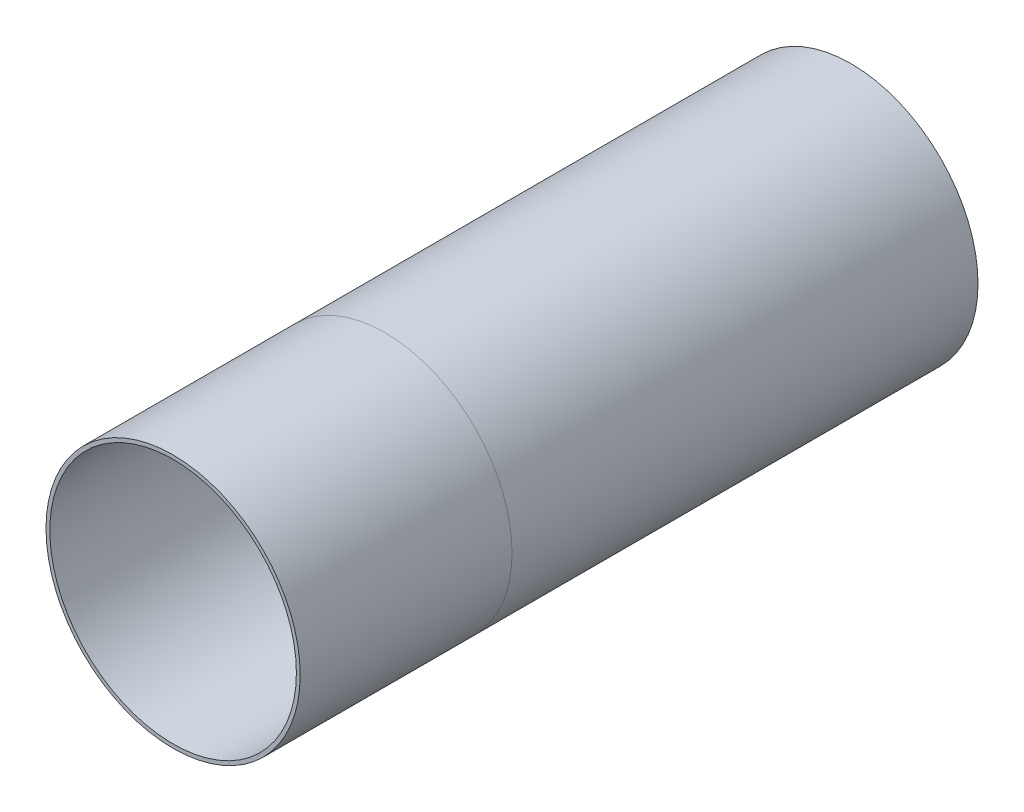
ISO-10303-21;
HEADER;
FILE_DESCRIPTION(('STEP AP214'),'2;1');
FILE_NAME('part.step','',(''),(''),'','','');
FILE_SCHEMA(('AUTOMOTIVE_DESIGN { 1 0 10303 214 1 1 1 1 }'));
ENDSEC;
DATA;
#1=APPLICATION_CONTEXT('core data for automotive mechanical design processes');
#2=APPLICATION_PROTOCOL_DEFINITION('international standard','automotive_design',2000,#1);
#3=PRODUCT_CONTEXT('',#1,'mechanical');
#4=PRODUCT('Part','Part','',(#3));
#5=PRODUCT_RELATED_PRODUCT_CATEGORY('part','',(#4));
#6=PRODUCT_DEFINITION_FORMATION('','',#4);
#7=PRODUCT_DEFINITION_CONTEXT('part definition',#1,'design');
#8=PRODUCT_DEFINITION('design','',#6,#7);
#9=PRODUCT_DEFINITION_SHAPE('','',#8);
#10=(LENGTH_UNIT() NAMED_UNIT(*) SI_UNIT(.MILLI.,.METRE.));
#11=(NAMED_UNIT(*) PLANE_ANGLE_UNIT() SI_UNIT($,.RADIAN.));
#12=(NAMED_UNIT(*) SI_UNIT($,.STERADIAN.) SOLID_ANGLE_UNIT());
#13=UNCERTAINTY_MEASURE_WITH_UNIT(LENGTH_MEASURE(1.E-05),#10,'distance_accuracy_value','');
#14=(GEOMETRIC_REPRESENTATION_CONTEXT(3) GLOBAL_UNCERTAINTY_ASSIGNED_CONTEXT((#13)) GLOBAL_UNIT_ASSIGNED_CONTEXT((#10,
#11,#12)) REPRESENTATION_CONTEXT('',''));
#15=CARTESIAN_POINT('',(0.,0.,0.));
#16=DIRECTION('',(0.,0.,1.));
#17=DIRECTION('',(1.,0.,0.));
#18=AXIS2_PLACEMENT_3D('',#15,#16,#17);
#19=CARTESIAN_POINT('',(0.,0.,0.));
#20=DIRECTION('',(0.,0.,1.));
#21=DIRECTION('',(1.,0.,0.));
#22=AXIS2_PLACEMENT_3D('',#19,#20,#21);
#23=PLANE('',#22);
#24=CARTESIAN_POINT('',(0.,0.,0.));
#25=DIRECTION('',(0.,0.,1.));
#26=DIRECTION('',(1.,0.,0.));
#27=AXIS2_PLACEMENT_3D('',#24,#25,#26);
#28=CIRCLE('',#27,76.1746);
#29=CARTESIAN_POINT('',(76.1746,0.,0.));
#30=VERTEX_POINT('',#29);
#31=EDGE_CURVE('E47',#30,#30,#28,.T.);
#32=ORIENTED_EDGE('',*,*,#31,.F.);
#33=EDGE_LOOP('',(#32));
#34=FACE_BOUND('',#33,.T.);
#35=CARTESIAN_POINT('',(0.,0.,0.));
#36=DIRECTION('',(0.,0.,1.));
#37=DIRECTION('',(1.,0.,0.));
#38=AXIS2_PLACEMENT_3D('',#35,#36,#37);
#39=CIRCLE('',#38,73.914);
#40=CARTESIAN_POINT('',(73.914,0.,0.));
#41=VERTEX_POINT('',#40);
#42=EDGE_CURVE('E54',#41,#41,#39,.T.);
#43=ORIENTED_EDGE('',*,*,#42,.T.);
#44=EDGE_LOOP('',(#43));
#45=FACE_BOUND('',#44,.T.);
#46=ADVANCED_FACE('F43',(#34,#45),#23,.F.);
#47=CARTESIAN_POINT('',(0.,0.,279.4));
#48=DIRECTION('',(0.,0.,-1.));
#49=DIRECTION('',(-1.,0.,0.));
#50=AXIS2_PLACEMENT_3D('',#47,#48,#49);
#51=CYLINDRICAL_SURFACE('',#50,76.1746);
#52=CARTESIAN_POINT('',(0.,0.,279.4));
#53=DIRECTION('',(0.,0.,1.));
#54=DIRECTION('',(1.,0.,0.));
#55=AXIS2_PLACEMENT_3D('',#52,#53,#54);
#56=CIRCLE('',#55,76.1746);
#57=CARTESIAN_POINT('',(76.1746,0.,279.4));
#58=VERTEX_POINT('',#57);
#59=EDGE_CURVE('E10',#58,#58,#56,.T.);
#60=ORIENTED_EDGE('',*,*,#59,.F.);
#61=EDGE_LOOP('',(#60));
#62=FACE_BOUND('',#61,.T.);
#63=ORIENTED_EDGE('',*,*,#31,.T.);
#64=EDGE_LOOP('',(#63));
#65=FACE_BOUND('',#64,.T.);
#66=ADVANCED_FACE('F45',(#62,#65),#51,.T.);
#67=CARTESIAN_POINT('',(0.,0.,279.4));
#68=DIRECTION('',(0.,0.,-1.));
#69=DIRECTION('',(-1.,0.,0.));
#70=AXIS2_PLACEMENT_3D('',#67,#68,#69);
#71=CYLINDRICAL_SURFACE('',#70,73.914);
#72=ORIENTED_EDGE('',*,*,#42,.F.);
#73=EDGE_LOOP('',(#72));
#74=FACE_BOUND('',#73,.T.);
#75=CARTESIAN_POINT('',(0.,0.,406.4));
#76=DIRECTION('',(0.,0.,1.));
#77=DIRECTION('',(1.,0.,0.));
#78=AXIS2_PLACEMENT_3D('',#75,#76,#77);
#79=CIRCLE('',#78,73.914);
#80=CARTESIAN_POINT('',(73.914,0.,406.4));
#81=VERTEX_POINT('',#80);
#82=EDGE_CURVE('E62',#81,#81,#79,.T.);
#83=ORIENTED_EDGE('',*,*,#82,.T.);
#84=EDGE_LOOP('',(#83));
#85=FACE_BOUND('',#84,.T.);
#86=ADVANCED_FACE('F68',(#74,#85),#71,.F.);
#87=CARTESIAN_POINT('',(0.,0.,406.4));
#88=DIRECTION('',(0.,0.,1.));
#89=DIRECTION('',(1.,0.,0.));
#90=AXIS2_PLACEMENT_3D('',#87,#88,#89);
#91=PLANE('',#90);
#92=CARTESIAN_POINT('',(0.,0.,406.4));
#93=DIRECTION('',(0.,0.,1.));
#94=DIRECTION('',(1.,0.,0.));
#95=AXIS2_PLACEMENT_3D('',#92,#93,#94);
#96=CIRCLE('',#95,76.2);
#97=CARTESIAN_POINT('',(76.2,0.,406.4));
#98=VERTEX_POINT('',#97);
#99=EDGE_CURVE('E58',#98,#98,#96,.T.);
#100=ORIENTED_EDGE('',*,*,#99,.T.);
#101=EDGE_LOOP('',(#100));
#102=FACE_BOUND('',#101,.T.);
#103=ORIENTED_EDGE('',*,*,#82,.F.);
#104=EDGE_LOOP('',(#103));
#105=FACE_BOUND('',#104,.T.);
#106=ADVANCED_FACE('F70',(#102,#105),#91,.T.);
#107=CARTESIAN_POINT('',(0.,0.,279.4));
#108=DIRECTION('',(0.,0.,1.));
#109=DIRECTION('',(1.,0.,0.));
#110=AXIS2_PLACEMENT_3D('',#107,#108,#109);
#111=PLANE('',#110);
#112=ORIENTED_EDGE('',*,*,#59,.T.);
#113=EDGE_LOOP('',(#112));
#114=FACE_BOUND('',#113,.T.);
#115=CARTESIAN_POINT('',(0.,0.,279.4));
#116=DIRECTION('',(0.,0.,1.));
#117=DIRECTION('',(1.,0.,0.));
#118=AXIS2_PLACEMENT_3D('',#115,#116,#117);
#119=CIRCLE('',#118,76.2);
#120=CARTESIAN_POINT('',(76.2,0.,279.4));
#121=VERTEX_POINT('',#120);
#122=EDGE_CURVE('E59',#121,#121,#119,.T.);
#123=ORIENTED_EDGE('',*,*,#122,.F.);
#124=EDGE_LOOP('',(#123));
#125=FACE_BOUND('',#124,.T.);
#126=ADVANCED_FACE('F72',(#114,#125),#111,.F.);
#127=CARTESIAN_POINT('',(0.,0.,406.4));
#128=DIRECTION('',(0.,0.,-1.));
#129=DIRECTION('',(-1.,0.,0.));
#130=AXIS2_PLACEMENT_3D('',#127,#128,#129);
#131=CYLINDRICAL_SURFACE('',#130,76.2);
#132=ORIENTED_EDGE('',*,*,#99,.F.);
#133=EDGE_LOOP('',(#132));
#134=FACE_BOUND('',#133,.T.);
#135=ORIENTED_EDGE('',*,*,#122,.T.);
#136=EDGE_LOOP('',(#135));
#137=FACE_BOUND('',#136,.T.);
#138=ADVANCED_FACE('F79',(#134,#137),#131,.T.);
#139=CLOSED_SHELL('',(#46,#66,#86,#106,#126,#138));
#140=MANIFOLD_SOLID_BREP('B2',#139);
#141=ADVANCED_BREP_SHAPE_REPRESENTATION('',(#18,#140),#14);
#142=SHAPE_DEFINITION_REPRESENTATION(#9,#141);
ENDSEC;
END-ISO-10303-21;
